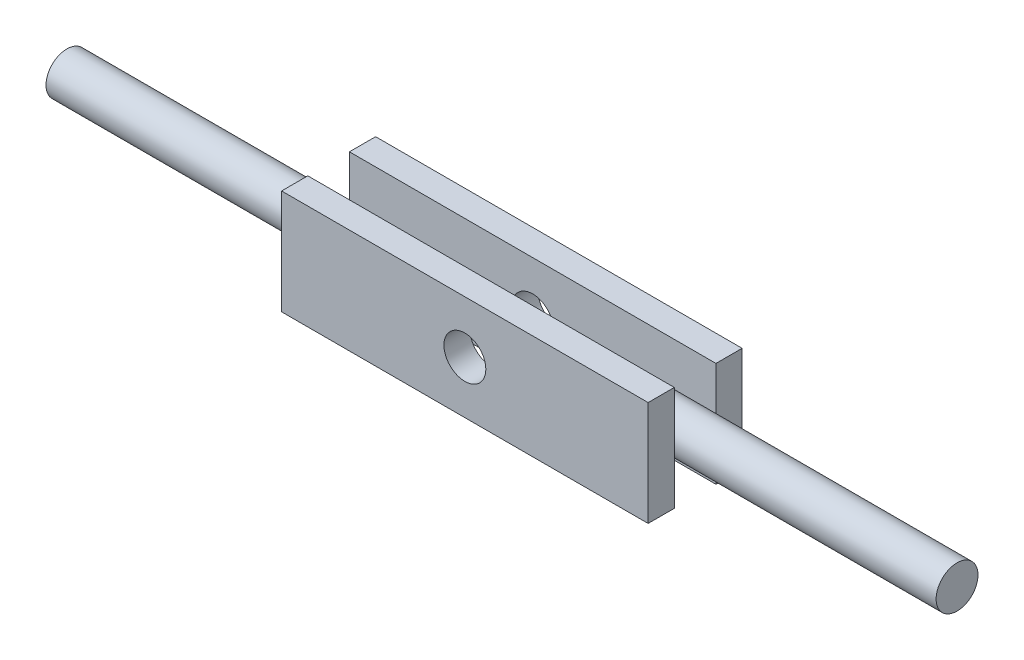
ISO-10303-21;
HEADER;
FILE_DESCRIPTION(('STEP AP214'),'2;1');
FILE_NAME('part.step','',(''),(''),'','','');
FILE_SCHEMA(('AUTOMOTIVE_DESIGN { 1 0 10303 214 1 1 1 1 }'));
ENDSEC;
DATA;
#1=APPLICATION_CONTEXT('core data for automotive mechanical design processes');
#2=APPLICATION_PROTOCOL_DEFINITION('international standard','automotive_design',2000,#1);
#3=PRODUCT_CONTEXT('',#1,'mechanical');
#4=PRODUCT('Part','Part','',(#3));
#5=PRODUCT_RELATED_PRODUCT_CATEGORY('part','',(#4));
#6=PRODUCT_DEFINITION_FORMATION('','',#4);
#7=PRODUCT_DEFINITION_CONTEXT('part definition',#1,'design');
#8=PRODUCT_DEFINITION('design','',#6,#7);
#9=PRODUCT_DEFINITION_SHAPE('','',#8);
#10=(LENGTH_UNIT() NAMED_UNIT(*) SI_UNIT(.MILLI.,.METRE.));
#11=(NAMED_UNIT(*) PLANE_ANGLE_UNIT() SI_UNIT($,.RADIAN.));
#12=(NAMED_UNIT(*) SI_UNIT($,.STERADIAN.) SOLID_ANGLE_UNIT());
#13=UNCERTAINTY_MEASURE_WITH_UNIT(LENGTH_MEASURE(1.E-05),#10,'distance_accuracy_value','');
#14=(GEOMETRIC_REPRESENTATION_CONTEXT(3) GLOBAL_UNCERTAINTY_ASSIGNED_CONTEXT((#13)) GLOBAL_UNIT_ASSIGNED_CONTEXT((#10,
#11,#12)) REPRESENTATION_CONTEXT('',''));
#15=CARTESIAN_POINT('',(0.,0.,0.));
#16=DIRECTION('',(0.,0.,1.));
#17=DIRECTION('',(1.,0.,0.));
#18=AXIS2_PLACEMENT_3D('',#15,#16,#17);
#19=CARTESIAN_POINT('',(-50.,0.,-8.));
#20=DIRECTION('',(-1.,0.,0.));
#21=DIRECTION('',(0.,0.,1.));
#22=AXIS2_PLACEMENT_3D('',#19,#20,#21);
#23=CYLINDRICAL_SURFACE('',#22,8.);
#24=CARTESIAN_POINT('',(-50.,0.,-8.));
#25=DIRECTION('',(-1.,0.,0.));
#26=DIRECTION('',(0.,0.,1.));
#27=AXIS2_PLACEMENT_3D('',#24,#25,#26);
#28=CIRCLE('',#27,8.);
#29=CARTESIAN_POINT('',(-50.,0.,0.));
#30=VERTEX_POINT('',#29);
#31=EDGE_CURVE('E11',#30,#30,#28,.T.);
#32=ORIENTED_EDGE('',*,*,#31,.T.);
#33=EDGE_LOOP('',(#32));
#34=FACE_BOUND('',#33,.T.);
#35=CARTESIAN_POINT('',(-170.,0.,-8.));
#36=DIRECTION('',(-1.,0.,0.));
#37=DIRECTION('',(0.,0.,1.));
#38=AXIS2_PLACEMENT_3D('',#35,#36,#37);
#39=CIRCLE('',#38,8.);
#40=CARTESIAN_POINT('',(-170.,0.,0.));
#41=VERTEX_POINT('',#40);
#42=EDGE_CURVE('E49',#41,#41,#39,.T.);
#43=ORIENTED_EDGE('',*,*,#42,.F.);
#44=EDGE_LOOP('',(#43));
#45=FACE_BOUND('',#44,.T.);
#46=ADVANCED_FACE('F43',(#34,#45),#23,.T.);
#47=CARTESIAN_POINT('',(-50.,0.,-8.));
#48=DIRECTION('',(-1.,0.,0.));
#49=DIRECTION('',(0.,0.,1.));
#50=AXIS2_PLACEMENT_3D('',#47,#48,#49);
#51=PLANE('',#50);
#52=ORIENTED_EDGE('',*,*,#31,.F.);
#53=EDGE_LOOP('',(#52));
#54=FACE_BOUND('',#53,.T.);
#55=ADVANCED_FACE('F58',(#54),#51,.F.);
#56=CARTESIAN_POINT('',(-170.,0.,-8.));
#57=DIRECTION('',(-1.,0.,0.));
#58=DIRECTION('',(0.,0.,1.));
#59=AXIS2_PLACEMENT_3D('',#56,#57,#58);
#60=PLANE('',#59);
#61=ORIENTED_EDGE('',*,*,#42,.T.);
#62=EDGE_LOOP('',(#61));
#63=FACE_BOUND('',#62,.T.);
#64=ADVANCED_FACE('F55',(#63),#60,.T.);
#65=CLOSED_SHELL('',(#46,#55,#64));
#66=MANIFOLD_SOLID_BREP('B2',#65);
#67=CARTESIAN_POINT('',(50.,0.,-8.));
#68=DIRECTION('',(1.,0.,0.));
#69=DIRECTION('',(0.,0.,-1.));
#70=AXIS2_PLACEMENT_3D('',#67,#68,#69);
#71=CYLINDRICAL_SURFACE('',#70,8.);
#72=DIRECTION('',(1.,0.,0.));
#73=VECTOR('',#72,1.);
#74=CARTESIAN_POINT('',(50.,-1.26095202129188,-15.9));
#75=LINE('',#74,#73);
#76=CARTESIAN_POINT('',(70.,-1.26095202129188,-15.9));
#77=VERTEX_POINT('',#76);
#78=CARTESIAN_POINT('',(50.,-1.26095202129188,-15.9));
#79=VERTEX_POINT('',#78);
#80=EDGE_CURVE('E106',#77,#79,#75,.F.);
#81=ORIENTED_EDGE('',*,*,#80,.F.);
#82=CARTESIAN_POINT('',(70.,0.,-8.));
#83=DIRECTION('',(-1.,0.,0.));
#84=DIRECTION('',(0.,0.,1.));
#85=AXIS2_PLACEMENT_3D('',#82,#83,#84);
#86=CIRCLE('',#85,8.);
#87=CARTESIAN_POINT('',(70.,1.26095202129188,-15.9));
#88=VERTEX_POINT('',#87);
#89=EDGE_CURVE('E41',#77,#88,#86,.F.);
#90=ORIENTED_EDGE('',*,*,#89,.T.);
#91=DIRECTION('',(1.,0.,0.));
#92=VECTOR('',#91,1.);
#93=CARTESIAN_POINT('',(50.,1.26095202129188,-15.9));
#94=LINE('',#93,#92);
#95=CARTESIAN_POINT('',(50.,1.26095202129188,-15.9));
#96=VERTEX_POINT('',#95);
#97=EDGE_CURVE('E166',#96,#88,#94,.T.);
#98=ORIENTED_EDGE('',*,*,#97,.F.);
#99=CARTESIAN_POINT('',(50.,0.,-8.));
#100=DIRECTION('',(1.,0.,0.));
#101=DIRECTION('',(0.,0.,-1.));
#102=AXIS2_PLACEMENT_3D('',#99,#100,#101);
#103=CIRCLE('',#102,8.);
#104=EDGE_CURVE('E177',#96,#79,#103,.T.);
#105=ORIENTED_EDGE('',*,*,#104,.T.);
#106=EDGE_LOOP('',(#81,#90,#98,#105));
#107=FACE_BOUND('',#106,.T.);
#108=CARTESIAN_POINT('',(170.,0.,-8.));
#109=DIRECTION('',(1.,0.,0.));
#110=DIRECTION('',(0.,0.,-1.));
#111=AXIS2_PLACEMENT_3D('',#108,#109,#110);
#112=CIRCLE('',#111,8.);
#113=CARTESIAN_POINT('',(170.,0.,-16.));
#114=VERTEX_POINT('',#113);
#115=EDGE_CURVE('E174',#114,#114,#112,.T.);
#116=ORIENTED_EDGE('',*,*,#115,.F.);
#117=EDGE_LOOP('',(#116));
#118=FACE_BOUND('',#117,.T.);
#119=ADVANCED_FACE('F92',(#107,#118),#71,.T.);
#120=CARTESIAN_POINT('',(50.,0.,-8.));
#121=DIRECTION('',(1.,0.,0.));
#122=DIRECTION('',(0.,0.,-1.));
#123=AXIS2_PLACEMENT_3D('',#120,#121,#122);
#124=PLANE('',#123);
#125=ORIENTED_EDGE('',*,*,#104,.F.);
#126=DIRECTION('',(0.,-1.,0.));
#127=VECTOR('',#126,1.);
#128=CARTESIAN_POINT('',(50.,0.,-15.9));
#129=LINE('',#128,#127);
#130=EDGE_CURVE('E99',#96,#79,#129,.T.);
#131=ORIENTED_EDGE('',*,*,#130,.T.);
#132=EDGE_LOOP('',(#125,#131));
#133=FACE_BOUND('',#132,.T.);
#134=ADVANCED_FACE('F181',(#133),#124,.F.);
#135=CARTESIAN_POINT('',(170.,0.,-8.));
#136=DIRECTION('',(1.,0.,0.));
#137=DIRECTION('',(0.,0.,-1.));
#138=AXIS2_PLACEMENT_3D('',#135,#136,#137);
#139=PLANE('',#138);
#140=ORIENTED_EDGE('',*,*,#115,.T.);
#141=EDGE_LOOP('',(#140));
#142=FACE_BOUND('',#141,.T.);
#143=ADVANCED_FACE('F225',(#142),#139,.T.);
#144=CARTESIAN_POINT('',(-70.,-20.,-15.9));
#145=DIRECTION('',(1.,0.,0.));
#146=DIRECTION('',(0.,0.,-1.));
#147=AXIS2_PLACEMENT_3D('',#144,#145,#146);
#148=PLANE('',#147);
#149=DIRECTION('',(0.,-1.,0.));
#150=VECTOR('',#149,1.);
#151=CARTESIAN_POINT('',(-70.,-20.,-25.9));
#152=LINE('',#151,#150);
#153=CARTESIAN_POINT('',(-70.,20.,-25.9));
#154=VERTEX_POINT('',#153);
#155=CARTESIAN_POINT('',(-70.,-20.,-25.9));
#156=VERTEX_POINT('',#155);
#157=EDGE_CURVE('E165',#154,#156,#152,.T.);
#158=ORIENTED_EDGE('',*,*,#157,.T.);
#159=DIRECTION('',(0.,0.,-1.));
#160=VECTOR('',#159,1.);
#161=CARTESIAN_POINT('',(-70.,-20.,-15.9));
#162=LINE('',#161,#160);
#163=CARTESIAN_POINT('',(-70.,-20.,-15.9));
#164=VERTEX_POINT('',#163);
#165=EDGE_CURVE('E146',#164,#156,#162,.T.);
#166=ORIENTED_EDGE('',*,*,#165,.F.);
#167=DIRECTION('',(0.,-1.,0.));
#168=VECTOR('',#167,1.);
#169=CARTESIAN_POINT('',(-70.,-20.,-15.9));
#170=LINE('',#169,#168);
#171=CARTESIAN_POINT('',(-70.,20.,-15.9));
#172=VERTEX_POINT('',#171);
#173=EDGE_CURVE('E152',#172,#164,#170,.T.);
#174=ORIENTED_EDGE('',*,*,#173,.F.);
#175=DIRECTION('',(0.,0.,-1.));
#176=VECTOR('',#175,1.);
#177=CARTESIAN_POINT('',(-70.,20.,-15.9));
#178=LINE('',#177,#176);
#179=EDGE_CURVE('E193',#172,#154,#178,.T.);
#180=ORIENTED_EDGE('',*,*,#179,.T.);
#181=EDGE_LOOP('',(#158,#166,#174,#180));
#182=FACE_BOUND('',#181,.T.);
#183=ADVANCED_FACE('F163',(#182),#148,.F.);
#184=CARTESIAN_POINT('',(70.,-20.,-15.9));
#185=DIRECTION('',(0.,1.,0.));
#186=DIRECTION('',(-1.,0.,0.));
#187=AXIS2_PLACEMENT_3D('',#184,#185,#186);
#188=PLANE('',#187);
#189=DIRECTION('',(1.,0.,0.));
#190=VECTOR('',#189,1.);
#191=CARTESIAN_POINT('',(70.,-20.,-25.9));
#192=LINE('',#191,#190);
#193=CARTESIAN_POINT('',(70.,-20.,-25.9));
#194=VERTEX_POINT('',#193);
#195=EDGE_CURVE('E195',#156,#194,#192,.T.);
#196=ORIENTED_EDGE('',*,*,#195,.T.);
#197=DIRECTION('',(0.,0.,-1.));
#198=VECTOR('',#197,1.);
#199=CARTESIAN_POINT('',(70.,-20.,-15.9));
#200=LINE('',#199,#198);
#201=CARTESIAN_POINT('',(70.,-20.,-15.9));
#202=VERTEX_POINT('',#201);
#203=EDGE_CURVE('E149',#202,#194,#200,.T.);
#204=ORIENTED_EDGE('',*,*,#203,.F.);
#205=DIRECTION('',(1.,0.,0.));
#206=VECTOR('',#205,1.);
#207=CARTESIAN_POINT('',(70.,-20.,-15.9));
#208=LINE('',#207,#206);
#209=EDGE_CURVE('E142',#164,#202,#208,.T.);
#210=ORIENTED_EDGE('',*,*,#209,.F.);
#211=ORIENTED_EDGE('',*,*,#165,.T.);
#212=EDGE_LOOP('',(#196,#204,#210,#211));
#213=FACE_BOUND('',#212,.T.);
#214=ADVANCED_FACE('F144',(#213),#188,.F.);
#215=CARTESIAN_POINT('',(70.,-20.,-15.9));
#216=DIRECTION('',(-1.,0.,0.));
#217=DIRECTION('',(0.,0.,1.));
#218=AXIS2_PLACEMENT_3D('',#215,#216,#217);
#219=PLANE('',#218);
#220=ORIENTED_EDGE('',*,*,#89,.F.);
#221=DIRECTION('',(0.,1.,0.));
#222=VECTOR('',#221,1.);
#223=CARTESIAN_POINT('',(70.,-20.,-15.9));
#224=LINE('',#223,#222);
#225=EDGE_CURVE('E189',#202,#77,#224,.T.);
#226=ORIENTED_EDGE('',*,*,#225,.F.);
#227=ORIENTED_EDGE('',*,*,#203,.T.);
#228=DIRECTION('',(0.,1.,0.));
#229=VECTOR('',#228,1.);
#230=CARTESIAN_POINT('',(70.,-20.,-25.9));
#231=LINE('',#230,#229);
#232=CARTESIAN_POINT('',(70.,20.,-25.9));
#233=VERTEX_POINT('',#232);
#234=EDGE_CURVE('E198',#194,#233,#231,.T.);
#235=ORIENTED_EDGE('',*,*,#234,.T.);
#236=DIRECTION('',(0.,0.,-1.));
#237=VECTOR('',#236,1.);
#238=CARTESIAN_POINT('',(70.,20.,-15.9));
#239=LINE('',#238,#237);
#240=CARTESIAN_POINT('',(70.,20.,-15.9));
#241=VERTEX_POINT('',#240);
#242=EDGE_CURVE('E169',#241,#233,#239,.T.);
#243=ORIENTED_EDGE('',*,*,#242,.F.);
#244=EDGE_CURVE('E151',#88,#241,#224,.T.);
#245=ORIENTED_EDGE('',*,*,#244,.F.);
#246=EDGE_LOOP('',(#220,#226,#227,#235,#243,#245));
#247=FACE_BOUND('',#246,.T.);
#248=ADVANCED_FACE('F187',(#247),#219,.F.);
#249=CARTESIAN_POINT('',(70.,20.,-15.9));
#250=DIRECTION('',(0.,-1.,0.));
#251=DIRECTION('',(1.,0.,0.));
#252=AXIS2_PLACEMENT_3D('',#249,#250,#251);
#253=PLANE('',#252);
#254=DIRECTION('',(-1.,0.,0.));
#255=VECTOR('',#254,1.);
#256=CARTESIAN_POINT('',(70.,20.,-25.9));
#257=LINE('',#256,#255);
#258=EDGE_CURVE('E161',#233,#154,#257,.T.);
#259=ORIENTED_EDGE('',*,*,#258,.T.);
#260=ORIENTED_EDGE('',*,*,#179,.F.);
#261=DIRECTION('',(-1.,0.,0.));
#262=VECTOR('',#261,1.);
#263=CARTESIAN_POINT('',(70.,20.,-15.9));
#264=LINE('',#263,#262);
#265=EDGE_CURVE('E157',#241,#172,#264,.T.);
#266=ORIENTED_EDGE('',*,*,#265,.F.);
#267=ORIENTED_EDGE('',*,*,#242,.T.);
#268=EDGE_LOOP('',(#259,#260,#266,#267));
#269=FACE_BOUND('',#268,.T.);
#270=ADVANCED_FACE('F203',(#269),#253,.F.);
#271=CARTESIAN_POINT('',(0.,0.,-15.9));
#272=DIRECTION('',(0.,0.,1.));
#273=DIRECTION('',(1.,0.,0.));
#274=AXIS2_PLACEMENT_3D('',#271,#272,#273);
#275=PLANE('',#274);
#276=CARTESIAN_POINT('',(0.,0.,-15.9));
#277=DIRECTION('',(0.,0.,1.));
#278=DIRECTION('',(1.,0.,0.));
#279=AXIS2_PLACEMENT_3D('',#276,#277,#278);
#280=CIRCLE('',#279,8.);
#281=CARTESIAN_POINT('',(8.,0.,-15.9));
#282=VERTEX_POINT('',#281);
#283=EDGE_CURVE('E196',#282,#282,#280,.T.);
#284=ORIENTED_EDGE('',*,*,#283,.F.);
#285=EDGE_LOOP('',(#284));
#286=FACE_BOUND('',#285,.T.);
#287=ORIENTED_EDGE('',*,*,#225,.T.);
#288=ORIENTED_EDGE('',*,*,#80,.T.);
#289=ORIENTED_EDGE('',*,*,#130,.F.);
#290=ORIENTED_EDGE('',*,*,#97,.T.);
#291=ORIENTED_EDGE('',*,*,#244,.T.);
#292=ORIENTED_EDGE('',*,*,#265,.T.);
#293=ORIENTED_EDGE('',*,*,#173,.T.);
#294=ORIENTED_EDGE('',*,*,#209,.T.);
#295=EDGE_LOOP('',(#287,#288,#289,#290,#291,#292,#293,#294));
#296=FACE_BOUND('',#295,.T.);
#297=ADVANCED_FACE('F155',(#286,#296),#275,.T.);
#298=CARTESIAN_POINT('',(0.,0.,-25.9));
#299=DIRECTION('',(0.,0.,1.));
#300=DIRECTION('',(1.,0.,0.));
#301=AXIS2_PLACEMENT_3D('',#298,#299,#300);
#302=PLANE('',#301);
#303=CARTESIAN_POINT('',(0.,0.,-25.9));
#304=DIRECTION('',(0.,0.,-1.));
#305=DIRECTION('',(-1.,0.,0.));
#306=AXIS2_PLACEMENT_3D('',#303,#304,#305);
#307=CIRCLE('',#306,8.);
#308=CARTESIAN_POINT('',(-8.,0.,-25.9));
#309=VERTEX_POINT('',#308);
#310=EDGE_CURVE('E294',#309,#309,#307,.T.);
#311=ORIENTED_EDGE('',*,*,#310,.F.);
#312=EDGE_LOOP('',(#311));
#313=FACE_BOUND('',#312,.T.);
#314=ORIENTED_EDGE('',*,*,#157,.F.);
#315=ORIENTED_EDGE('',*,*,#258,.F.);
#316=ORIENTED_EDGE('',*,*,#234,.F.);
#317=ORIENTED_EDGE('',*,*,#195,.F.);
#318=EDGE_LOOP('',(#314,#315,#316,#317));
#319=FACE_BOUND('',#318,.T.);
#320=ADVANCED_FACE('F206',(#313,#319),#302,.F.);
#321=CARTESIAN_POINT('',(0.,0.,74.1));
#322=DIRECTION('',(0.,0.,-1.));
#323=DIRECTION('',(-1.,0.,0.));
#324=AXIS2_PLACEMENT_3D('',#321,#322,#323);
#325=CYLINDRICAL_SURFACE('',#324,8.);
#326=ORIENTED_EDGE('',*,*,#283,.T.);
#327=EDGE_LOOP('',(#326));
#328=FACE_BOUND('',#327,.T.);
#329=ORIENTED_EDGE('',*,*,#310,.T.);
#330=EDGE_LOOP('',(#329));
#331=FACE_BOUND('',#330,.T.);
#332=ADVANCED_FACE('F208',(#328,#331),#325,.F.);
#333=CLOSED_SHELL('',(#119,#134,#143,#183,#214,#248,#270,#297,#320,#332));
#334=MANIFOLD_SOLID_BREP('B6',#333);
#335=CARTESIAN_POINT('',(-70.,-20.,10.));
#336=DIRECTION('',(1.,0.,0.));
#337=DIRECTION('',(0.,0.,-1.));
#338=AXIS2_PLACEMENT_3D('',#335,#336,#337);
#339=PLANE('',#338);
#340=DIRECTION('',(0.,-1.,0.));
#341=VECTOR('',#340,1.);
#342=CARTESIAN_POINT('',(-70.,-20.,0.));
#343=LINE('',#342,#341);
#344=CARTESIAN_POINT('',(-70.,20.,0.));
#345=VERTEX_POINT('',#344);
#346=CARTESIAN_POINT('',(-70.,-20.,0.));
#347=VERTEX_POINT('',#346);
#348=EDGE_CURVE('E365',#345,#347,#343,.T.);
#349=ORIENTED_EDGE('',*,*,#348,.T.);
#350=DIRECTION('',(0.,0.,-1.));
#351=VECTOR('',#350,1.);
#352=CARTESIAN_POINT('',(-70.,-20.,10.));
#353=LINE('',#352,#351);
#354=CARTESIAN_POINT('',(-70.,-20.,10.));
#355=VERTEX_POINT('',#354);
#356=EDGE_CURVE('E90',#355,#347,#353,.T.);
#357=ORIENTED_EDGE('',*,*,#356,.F.);
#358=DIRECTION('',(0.,-1.,0.));
#359=VECTOR('',#358,1.);
#360=CARTESIAN_POINT('',(-70.,-20.,10.));
#361=LINE('',#360,#359);
#362=CARTESIAN_POINT('',(-70.,20.,10.));
#363=VERTEX_POINT('',#362);
#364=EDGE_CURVE('E353',#363,#355,#361,.T.);
#365=ORIENTED_EDGE('',*,*,#364,.F.);
#366=DIRECTION('',(0.,0.,-1.));
#367=VECTOR('',#366,1.);
#368=CARTESIAN_POINT('',(-70.,20.,10.));
#369=LINE('',#368,#367);
#370=EDGE_CURVE('E361',#363,#345,#369,.T.);
#371=ORIENTED_EDGE('',*,*,#370,.T.);
#372=EDGE_LOOP('',(#349,#357,#365,#371));
#373=FACE_BOUND('',#372,.T.);
#374=ADVANCED_FACE('F302',(#373),#339,.F.);
#375=CARTESIAN_POINT('',(70.,-20.,10.));
#376=DIRECTION('',(0.,1.,0.));
#377=DIRECTION('',(-1.,0.,0.));
#378=AXIS2_PLACEMENT_3D('',#375,#376,#377);
#379=PLANE('',#378);
#380=DIRECTION('',(1.,0.,0.));
#381=VECTOR('',#380,1.);
#382=CARTESIAN_POINT('',(70.,-20.,0.));
#383=LINE('',#382,#381);
#384=CARTESIAN_POINT('',(70.,-20.,0.));
#385=VERTEX_POINT('',#384);
#386=EDGE_CURVE('E357',#347,#385,#383,.T.);
#387=ORIENTED_EDGE('',*,*,#386,.T.);
#388=DIRECTION('',(0.,0.,-1.));
#389=VECTOR('',#388,1.);
#390=CARTESIAN_POINT('',(70.,-20.,10.));
#391=LINE('',#390,#389);
#392=CARTESIAN_POINT('',(70.,-20.,10.));
#393=VERTEX_POINT('',#392);
#394=EDGE_CURVE('E310',#393,#385,#391,.T.);
#395=ORIENTED_EDGE('',*,*,#394,.F.);
#396=DIRECTION('',(1.,0.,0.));
#397=VECTOR('',#396,1.);
#398=CARTESIAN_POINT('',(70.,-20.,10.));
#399=LINE('',#398,#397);
#400=EDGE_CURVE('E348',#355,#393,#399,.T.);
#401=ORIENTED_EDGE('',*,*,#400,.F.);
#402=ORIENTED_EDGE('',*,*,#356,.T.);
#403=EDGE_LOOP('',(#387,#395,#401,#402));
#404=FACE_BOUND('',#403,.T.);
#405=ADVANCED_FACE('F356',(#404),#379,.F.);
#406=CARTESIAN_POINT('',(70.,-20.,10.));
#407=DIRECTION('',(-1.,0.,0.));
#408=DIRECTION('',(0.,0.,1.));
#409=AXIS2_PLACEMENT_3D('',#406,#407,#408);
#410=PLANE('',#409);
#411=DIRECTION('',(0.,1.,0.));
#412=VECTOR('',#411,1.);
#413=CARTESIAN_POINT('',(70.,-20.,0.));
#414=LINE('',#413,#412);
#415=CARTESIAN_POINT('',(70.,20.,0.));
#416=VERTEX_POINT('',#415);
#417=EDGE_CURVE('E335',#385,#416,#414,.T.);
#418=ORIENTED_EDGE('',*,*,#417,.T.);
#419=DIRECTION('',(0.,0.,-1.));
#420=VECTOR('',#419,1.);
#421=CARTESIAN_POINT('',(70.,20.,10.));
#422=LINE('',#421,#420);
#423=CARTESIAN_POINT('',(70.,20.,10.));
#424=VERTEX_POINT('',#423);
#425=EDGE_CURVE('E358',#424,#416,#422,.T.);
#426=ORIENTED_EDGE('',*,*,#425,.F.);
#427=DIRECTION('',(0.,1.,0.));
#428=VECTOR('',#427,1.);
#429=CARTESIAN_POINT('',(70.,-20.,10.));
#430=LINE('',#429,#428);
#431=EDGE_CURVE('E351',#393,#424,#430,.T.);
#432=ORIENTED_EDGE('',*,*,#431,.F.);
#433=ORIENTED_EDGE('',*,*,#394,.T.);
#434=EDGE_LOOP('',(#418,#426,#432,#433));
#435=FACE_BOUND('',#434,.T.);
#436=ADVANCED_FACE('F359',(#435),#410,.F.);
#437=CARTESIAN_POINT('',(70.,20.,10.));
#438=DIRECTION('',(0.,-1.,0.));
#439=DIRECTION('',(1.,0.,0.));
#440=AXIS2_PLACEMENT_3D('',#437,#438,#439);
#441=PLANE('',#440);
#442=DIRECTION('',(-1.,0.,0.));
#443=VECTOR('',#442,1.);
#444=CARTESIAN_POINT('',(70.,20.,0.));
#445=LINE('',#444,#443);
#446=EDGE_CURVE('E341',#416,#345,#445,.T.);
#447=ORIENTED_EDGE('',*,*,#446,.T.);
#448=ORIENTED_EDGE('',*,*,#370,.F.);
#449=DIRECTION('',(-1.,0.,0.));
#450=VECTOR('',#449,1.);
#451=CARTESIAN_POINT('',(70.,20.,10.));
#452=LINE('',#451,#450);
#453=EDGE_CURVE('E318',#424,#363,#452,.T.);
#454=ORIENTED_EDGE('',*,*,#453,.F.);
#455=ORIENTED_EDGE('',*,*,#425,.T.);
#456=EDGE_LOOP('',(#447,#448,#454,#455));
#457=FACE_BOUND('',#456,.T.);
#458=ADVANCED_FACE('F373',(#457),#441,.F.);
#459=CARTESIAN_POINT('',(0.,0.,10.));
#460=DIRECTION('',(0.,0.,1.));
#461=DIRECTION('',(1.,0.,0.));
#462=AXIS2_PLACEMENT_3D('',#459,#460,#461);
#463=PLANE('',#462);
#464=CARTESIAN_POINT('',(0.,0.,10.));
#465=DIRECTION('',(0.,0.,1.));
#466=DIRECTION('',(1.,0.,0.));
#467=AXIS2_PLACEMENT_3D('',#464,#465,#466);
#468=CIRCLE('',#467,8.);
#469=CARTESIAN_POINT('',(8.,0.,10.));
#470=VERTEX_POINT('',#469);
#471=EDGE_CURVE('E379',#470,#470,#468,.T.);
#472=ORIENTED_EDGE('',*,*,#471,.F.);
#473=EDGE_LOOP('',(#472));
#474=FACE_BOUND('',#473,.T.);
#475=ORIENTED_EDGE('',*,*,#364,.T.);
#476=ORIENTED_EDGE('',*,*,#400,.T.);
#477=ORIENTED_EDGE('',*,*,#431,.T.);
#478=ORIENTED_EDGE('',*,*,#453,.T.);
#479=EDGE_LOOP('',(#475,#476,#477,#478));
#480=FACE_BOUND('',#479,.T.);
#481=ADVANCED_FACE('F349',(#474,#480),#463,.T.);
#482=CARTESIAN_POINT('',(0.,0.,0.));
#483=DIRECTION('',(0.,0.,1.));
#484=DIRECTION('',(1.,0.,0.));
#485=AXIS2_PLACEMENT_3D('',#482,#483,#484);
#486=PLANE('',#485);
#487=CARTESIAN_POINT('',(0.,0.,0.));
#488=DIRECTION('',(0.,0.,1.));
#489=DIRECTION('',(1.,0.,0.));
#490=AXIS2_PLACEMENT_3D('',#487,#488,#489);
#491=CIRCLE('',#490,8.);
#492=CARTESIAN_POINT('',(8.,0.,0.));
#493=VERTEX_POINT('',#492);
#494=EDGE_CURVE('E368',#493,#493,#491,.T.);
#495=ORIENTED_EDGE('',*,*,#494,.T.);
#496=EDGE_LOOP('',(#495));
#497=FACE_BOUND('',#496,.T.);
#498=ORIENTED_EDGE('',*,*,#348,.F.);
#499=ORIENTED_EDGE('',*,*,#446,.F.);
#500=ORIENTED_EDGE('',*,*,#417,.F.);
#501=ORIENTED_EDGE('',*,*,#386,.F.);
#502=EDGE_LOOP('',(#498,#499,#500,#501));
#503=FACE_BOUND('',#502,.T.);
#504=ADVANCED_FACE('F376',(#497,#503),#486,.F.);
#505=CARTESIAN_POINT('',(0.,0.,0.));
#506=DIRECTION('',(0.,0.,1.));
#507=DIRECTION('',(1.,0.,0.));
#508=AXIS2_PLACEMENT_3D('',#505,#506,#507);
#509=CYLINDRICAL_SURFACE('',#508,8.);
#510=ORIENTED_EDGE('',*,*,#494,.F.);
#511=EDGE_LOOP('',(#510));
#512=FACE_BOUND('',#511,.T.);
#513=ORIENTED_EDGE('',*,*,#471,.T.);
#514=EDGE_LOOP('',(#513));
#515=FACE_BOUND('',#514,.T.);
#516=ADVANCED_FACE('F386',(#512,#515),#509,.F.);
#517=CLOSED_SHELL('',(#374,#405,#436,#458,#481,#504,#516));
#518=MANIFOLD_SOLID_BREP('B35',#517);
#519=ADVANCED_BREP_SHAPE_REPRESENTATION('',(#18,#66,#334,#518),#14);
#520=SHAPE_DEFINITION_REPRESENTATION(#9,#519);
ENDSEC;
END-ISO-10303-21;
